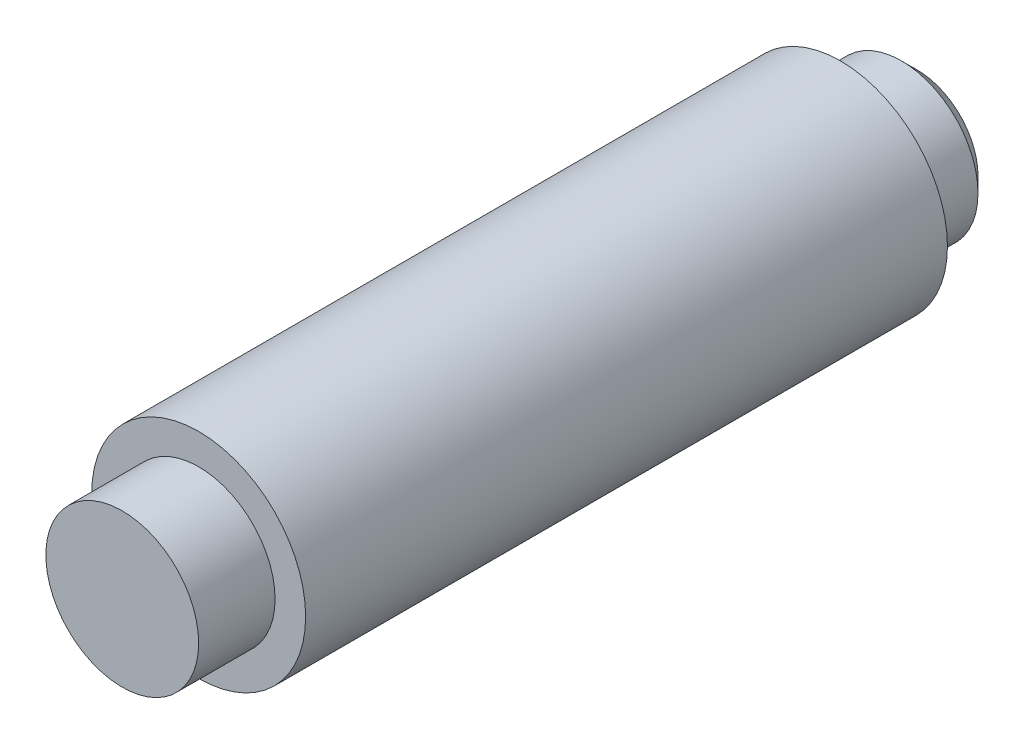
ISO-10303-21;
HEADER;
FILE_DESCRIPTION(('STEP AP214'),'2;1');
FILE_NAME('part.step','',(''),(''),'','','');
FILE_SCHEMA(('AUTOMOTIVE_DESIGN { 1 0 10303 214 1 1 1 1 }'));
ENDSEC;
DATA;
#1=APPLICATION_CONTEXT('core data for automotive mechanical design processes');
#2=APPLICATION_PROTOCOL_DEFINITION('international standard','automotive_design',2000,#1);
#3=PRODUCT_CONTEXT('',#1,'mechanical');
#4=PRODUCT('Part','Part','',(#3));
#5=PRODUCT_RELATED_PRODUCT_CATEGORY('part','',(#4));
#6=PRODUCT_DEFINITION_FORMATION('','',#4);
#7=PRODUCT_DEFINITION_CONTEXT('part definition',#1,'design');
#8=PRODUCT_DEFINITION('design','',#6,#7);
#9=PRODUCT_DEFINITION_SHAPE('','',#8);
#10=(LENGTH_UNIT() NAMED_UNIT(*) SI_UNIT(.MILLI.,.METRE.));
#11=(NAMED_UNIT(*) PLANE_ANGLE_UNIT() SI_UNIT($,.RADIAN.));
#12=(NAMED_UNIT(*) SI_UNIT($,.STERADIAN.) SOLID_ANGLE_UNIT());
#13=UNCERTAINTY_MEASURE_WITH_UNIT(LENGTH_MEASURE(1.E-05),#10,'distance_accuracy_value','');
#14=(GEOMETRIC_REPRESENTATION_CONTEXT(3) GLOBAL_UNCERTAINTY_ASSIGNED_CONTEXT((#13)) GLOBAL_UNIT_ASSIGNED_CONTEXT((#10,
#11,#12)) REPRESENTATION_CONTEXT('',''));
#15=CARTESIAN_POINT('',(0.,0.,0.));
#16=DIRECTION('',(0.,0.,1.));
#17=DIRECTION('',(1.,0.,0.));
#18=AXIS2_PLACEMENT_3D('',#15,#16,#17);
#19=CARTESIAN_POINT('',(0.,0.,21.));
#20=DIRECTION('',(0.,0.,-1.));
#21=DIRECTION('',(-1.,0.,0.));
#22=AXIS2_PLACEMENT_3D('',#19,#20,#21);
#23=CYLINDRICAL_SURFACE('',#22,3.5);
#24=CARTESIAN_POINT('',(0.,0.,21.));
#25=DIRECTION('',(0.,0.,1.));
#26=DIRECTION('',(1.,0.,0.));
#27=AXIS2_PLACEMENT_3D('',#24,#25,#26);
#28=CIRCLE('',#27,3.5);
#29=CARTESIAN_POINT('',(-3.5,0.,21.));
#30=VERTEX_POINT('',#29);
#31=EDGE_CURVE('E49',#30,#30,#28,.T.);
#32=CARTESIAN_POINT('',(0.,0.,0.));
#33=DIRECTION('',(0.,0.,1.));
#34=DIRECTION('',(1.,0.,0.));
#35=AXIS2_PLACEMENT_3D('',#32,#33,#34);
#36=CIRCLE('',#35,3.5);
#37=CARTESIAN_POINT('',(-3.5,0.,0.));
#38=VERTEX_POINT('',#37);
#39=EDGE_CURVE('E52',#38,#38,#36,.T.);
#40=CARTESIAN_POINT('',(-3.5,0.,21.));
#41=CARTESIAN_POINT('',(-3.5,0.,20.78125));
#42=CARTESIAN_POINT('',(-3.5,0.,20.5625));
#43=CARTESIAN_POINT('',(-3.5,0.,20.125));
#44=CARTESIAN_POINT('',(-3.5,0.,19.90625));
#45=CARTESIAN_POINT('',(-3.5,0.,19.46875));
#46=CARTESIAN_POINT('',(-3.5,0.,19.25));
#47=CARTESIAN_POINT('',(-3.5,0.,18.8125));
#48=CARTESIAN_POINT('',(-3.5,0.,18.59375));
#49=CARTESIAN_POINT('',(-3.5,0.,18.15625));
#50=CARTESIAN_POINT('',(-3.5,0.,17.9375));
#51=CARTESIAN_POINT('',(-3.5,0.,17.5));
#52=CARTESIAN_POINT('',(-3.5,0.,17.28125));
#53=CARTESIAN_POINT('',(-3.5,0.,16.84375));
#54=CARTESIAN_POINT('',(-3.5,0.,16.625));
#55=CARTESIAN_POINT('',(-3.5,0.,16.1875));
#56=CARTESIAN_POINT('',(-3.5,0.,15.96875));
#57=CARTESIAN_POINT('',(-3.5,0.,15.53125));
#58=CARTESIAN_POINT('',(-3.5,0.,15.3125));
#59=CARTESIAN_POINT('',(-3.5,0.,14.875));
#60=CARTESIAN_POINT('',(-3.5,0.,14.65625));
#61=CARTESIAN_POINT('',(-3.5,0.,14.21875));
#62=CARTESIAN_POINT('',(-3.5,0.,14.));
#63=CARTESIAN_POINT('',(-3.5,0.,13.5625));
#64=CARTESIAN_POINT('',(-3.5,0.,13.34375));
#65=CARTESIAN_POINT('',(-3.5,0.,12.90625));
#66=CARTESIAN_POINT('',(-3.5,0.,12.6875));
#67=CARTESIAN_POINT('',(-3.5,0.,12.25));
#68=CARTESIAN_POINT('',(-3.5,0.,12.03125));
#69=CARTESIAN_POINT('',(-3.5,0.,11.59375));
#70=CARTESIAN_POINT('',(-3.5,0.,11.375));
#71=CARTESIAN_POINT('',(-3.5,0.,10.9375));
#72=CARTESIAN_POINT('',(-3.5,0.,10.71875));
#73=CARTESIAN_POINT('',(-3.5,0.,10.28125));
#74=CARTESIAN_POINT('',(-3.5,0.,10.0625));
#75=CARTESIAN_POINT('',(-3.5,0.,9.625));
#76=CARTESIAN_POINT('',(-3.5,0.,9.40625));
#77=CARTESIAN_POINT('',(-3.5,0.,8.96875));
#78=CARTESIAN_POINT('',(-3.5,0.,8.75));
#79=CARTESIAN_POINT('',(-3.5,0.,8.3125));
#80=CARTESIAN_POINT('',(-3.5,0.,8.09375));
#81=CARTESIAN_POINT('',(-3.5,0.,7.65625));
#82=CARTESIAN_POINT('',(-3.5,0.,7.4375));
#83=CARTESIAN_POINT('',(-3.5,0.,7.));
#84=CARTESIAN_POINT('',(-3.5,0.,6.78125));
#85=CARTESIAN_POINT('',(-3.5,0.,6.34375));
#86=CARTESIAN_POINT('',(-3.5,0.,6.125));
#87=CARTESIAN_POINT('',(-3.5,0.,5.6875));
#88=CARTESIAN_POINT('',(-3.5,0.,5.46875));
#89=CARTESIAN_POINT('',(-3.5,0.,5.03125));
#90=CARTESIAN_POINT('',(-3.5,0.,4.8125));
#91=CARTESIAN_POINT('',(-3.5,0.,4.375));
#92=CARTESIAN_POINT('',(-3.5,0.,4.15625));
#93=CARTESIAN_POINT('',(-3.5,0.,3.71875));
#94=CARTESIAN_POINT('',(-3.5,0.,3.5));
#95=CARTESIAN_POINT('',(-3.5,0.,3.0625));
#96=CARTESIAN_POINT('',(-3.5,0.,2.84375));
#97=CARTESIAN_POINT('',(-3.5,0.,2.40625));
#98=CARTESIAN_POINT('',(-3.5,0.,2.1875));
#99=CARTESIAN_POINT('',(-3.5,0.,1.75));
#100=CARTESIAN_POINT('',(-3.5,0.,1.53125));
#101=CARTESIAN_POINT('',(-3.5,0.,1.09375));
#102=CARTESIAN_POINT('',(-3.5,0.,0.875000000000001));
#103=CARTESIAN_POINT('',(-3.5,0.,0.4375));
#104=CARTESIAN_POINT('',(-3.5,0.,0.21875));
#105=CARTESIAN_POINT('',(-3.5,0.,0.));
#106=B_SPLINE_CURVE_WITH_KNOTS('',3,(#40,#41,#42,#43,#44,#45,#46,#47,#48,#49,#50,#51,#52,#53,
#54,#55,#56,#57,#58,#59,#60,#61,#62,#63,#64,#65,#66,#67,#68,#69,#70,#71,#72,#73,#74,#75,#76,#77,
#78,#79,#80,#81,#82,#83,#84,#85,#86,#87,#88,#89,#90,#91,#92,#93,#94,#95,#96,#97,#98,#99,#100,
#101,#102,#103,#104,#105),.UNSPECIFIED.,.F.,.F.,(4,2,2,2,2,2,2,2,2,2,2,2,2,2,2,2,2,2,2,2,2,2,2,
2,2,2,2,2,2,2,2,2,4),(0.,0.656249999999997,1.3125,1.96875,2.625,3.28125,3.9375,4.59375,5.25,
5.90625,6.5625,7.21875,7.875,8.53125,9.1875,9.84375,10.5,11.15625,11.8125,12.46875,13.125,
13.78125,14.4375,15.09375,15.75,16.40625,17.0625,17.71875,18.375,19.03125,19.6875,20.34375,21.),.UNSPECIFIED.);
#107=EDGE_CURVE('BSEAM33',#30,#38,#106,.T.);
#108=ORIENTED_EDGE('',*,*,#31,.F.);
#109=ORIENTED_EDGE('',*,*,#39,.T.);
#110=ORIENTED_EDGE('',*,*,#107,.T.);
#111=ORIENTED_EDGE('',*,*,#107,.F.);
#112=EDGE_LOOP('',(#108,#110,#109,#111));
#113=FACE_BOUND('',#112,.T.);
#114=ADVANCED_FACE('F33',(#113),#23,.T.);
#115=CARTESIAN_POINT('',(0.,0.,21.));
#116=DIRECTION('',(0.,0.,1.));
#117=DIRECTION('',(1.,0.,0.));
#118=AXIS2_PLACEMENT_3D('',#115,#116,#117);
#119=PLANE('',#118);
#120=CARTESIAN_POINT('',(0.,0.,21.));
#121=DIRECTION('',(0.,0.,1.));
#122=DIRECTION('',(1.,0.,0.));
#123=AXIS2_PLACEMENT_3D('',#120,#121,#122);
#124=CIRCLE('',#123,2.5);
#125=CARTESIAN_POINT('',(2.5,0.,21.));
#126=VERTEX_POINT('',#125);
#127=EDGE_CURVE('E45',#126,#126,#124,.T.);
#128=ORIENTED_EDGE('',*,*,#127,.F.);
#129=EDGE_LOOP('',(#128));
#130=FACE_BOUND('',#129,.T.);
#131=ORIENTED_EDGE('',*,*,#31,.T.);
#132=EDGE_LOOP('',(#131));
#133=FACE_BOUND('',#132,.T.);
#134=ADVANCED_FACE('F73',(#130,#133),#119,.T.);
#135=CARTESIAN_POINT('',(0.,0.,0.));
#136=DIRECTION('',(0.,0.,1.));
#137=DIRECTION('',(1.,0.,0.));
#138=AXIS2_PLACEMENT_3D('',#135,#136,#137);
#139=PLANE('',#138);
#140=CARTESIAN_POINT('',(0.,0.,0.));
#141=DIRECTION('',(0.,0.,1.));
#142=DIRECTION('',(1.,0.,0.));
#143=AXIS2_PLACEMENT_3D('',#140,#141,#142);
#144=CIRCLE('',#143,2.5);
#145=CARTESIAN_POINT('',(2.5,0.,0.));
#146=VERTEX_POINT('',#145);
#147=EDGE_CURVE('E55',#146,#146,#144,.T.);
#148=ORIENTED_EDGE('',*,*,#147,.T.);
#149=EDGE_LOOP('',(#148));
#150=FACE_BOUND('',#149,.T.);
#151=ORIENTED_EDGE('',*,*,#39,.F.);
#152=EDGE_LOOP('',(#151));
#153=FACE_BOUND('',#152,.T.);
#154=ADVANCED_FACE('F76',(#150,#153),#139,.F.);
#155=CARTESIAN_POINT('',(0.,0.,-2.5));
#156=DIRECTION('',(0.,0.,1.));
#157=DIRECTION('',(1.,0.,0.));
#158=AXIS2_PLACEMENT_3D('',#155,#156,#157);
#159=CYLINDRICAL_SURFACE('',#158,2.5);
#160=CARTESIAN_POINT('',(0.,0.,-2.));
#161=DIRECTION('',(0.,0.,1.));
#162=DIRECTION('',(1.,0.,0.));
#163=AXIS2_PLACEMENT_3D('',#160,#161,#162);
#164=CIRCLE('',#163,2.5);
#165=CARTESIAN_POINT('',(2.5,0.,-2.));
#166=VERTEX_POINT('',#165);
#167=EDGE_CURVE('E41',#166,#166,#164,.T.);
#168=ORIENTED_EDGE('',*,*,#167,.T.);
#169=EDGE_LOOP('',(#168));
#170=FACE_BOUND('',#169,.T.);
#171=ORIENTED_EDGE('',*,*,#147,.F.);
#172=EDGE_LOOP('',(#171));
#173=FACE_BOUND('',#172,.T.);
#174=ADVANCED_FACE('F85',(#170,#173),#159,.T.);
#175=CARTESIAN_POINT('',(0.,0.,-2.5));
#176=DIRECTION('',(0.,0.,1.));
#177=DIRECTION('',(1.,0.,0.));
#178=AXIS2_PLACEMENT_3D('',#175,#176,#177);
#179=PLANE('',#178);
#180=CARTESIAN_POINT('',(0.,0.,-2.5));
#181=DIRECTION('',(0.,0.,1.));
#182=DIRECTION('',(1.,0.,0.));
#183=AXIS2_PLACEMENT_3D('',#180,#181,#182);
#184=CIRCLE('',#183,2.);
#185=CARTESIAN_POINT('',(2.,0.,-2.5));
#186=VERTEX_POINT('',#185);
#187=EDGE_CURVE('E10',#186,#186,#184,.F.);
#188=ORIENTED_EDGE('',*,*,#187,.T.);
#189=EDGE_LOOP('',(#188));
#190=FACE_BOUND('',#189,.T.);
#191=ADVANCED_FACE('F69',(#190),#179,.F.);
#192=CARTESIAN_POINT('',(0.,0.,23.5));
#193=DIRECTION('',(0.,0.,-1.));
#194=DIRECTION('',(-1.,0.,0.));
#195=AXIS2_PLACEMENT_3D('',#192,#193,#194);
#196=CYLINDRICAL_SURFACE('',#195,2.5);
#197=CARTESIAN_POINT('',(0.,0.,23.5));
#198=DIRECTION('',(0.,0.,1.));
#199=DIRECTION('',(1.,0.,0.));
#200=AXIS2_PLACEMENT_3D('',#197,#198,#199);
#201=CIRCLE('',#200,2.5);
#202=CARTESIAN_POINT('',(2.5,0.,23.5));
#203=VERTEX_POINT('',#202);
#204=EDGE_CURVE('E59',#203,#203,#201,.T.);
#205=ORIENTED_EDGE('',*,*,#204,.F.);
#206=EDGE_LOOP('',(#205));
#207=FACE_BOUND('',#206,.T.);
#208=ORIENTED_EDGE('',*,*,#127,.T.);
#209=EDGE_LOOP('',(#208));
#210=FACE_BOUND('',#209,.T.);
#211=ADVANCED_FACE('F66',(#207,#210),#196,.T.);
#212=CARTESIAN_POINT('',(0.,0.,23.5));
#213=DIRECTION('',(0.,0.,1.));
#214=DIRECTION('',(1.,0.,0.));
#215=AXIS2_PLACEMENT_3D('',#212,#213,#214);
#216=PLANE('',#215);
#217=ORIENTED_EDGE('',*,*,#204,.T.);
#218=EDGE_LOOP('',(#217));
#219=FACE_BOUND('',#218,.T.);
#220=ADVANCED_FACE('F64',(#219),#216,.T.);
#221=CARTESIAN_POINT('',(0.,0.,-2.));
#222=DIRECTION('',(0.,0.,1.));
#223=DIRECTION('',(1.,0.,0.));
#224=AXIS2_PLACEMENT_3D('',#221,#222,#223);
#225=CONICAL_SURFACE('',#224,2.5,0.785398163397454);
#226=ORIENTED_EDGE('',*,*,#187,.F.);
#227=EDGE_LOOP('',(#226));
#228=FACE_BOUND('',#227,.T.);
#229=ORIENTED_EDGE('',*,*,#167,.F.);
#230=EDGE_LOOP('',(#229));
#231=FACE_BOUND('',#230,.T.);
#232=ADVANCED_FACE('F36',(#228,#231),#225,.T.);
#233=CLOSED_SHELL('',(#114,#134,#154,#174,#191,#211,#220,#232));
#234=MANIFOLD_SOLID_BREP('B2',#233);
#235=ADVANCED_BREP_SHAPE_REPRESENTATION('',(#18,#234),#14);
#236=SHAPE_DEFINITION_REPRESENTATION(#9,#235);
ENDSEC;
END-ISO-10303-21;
